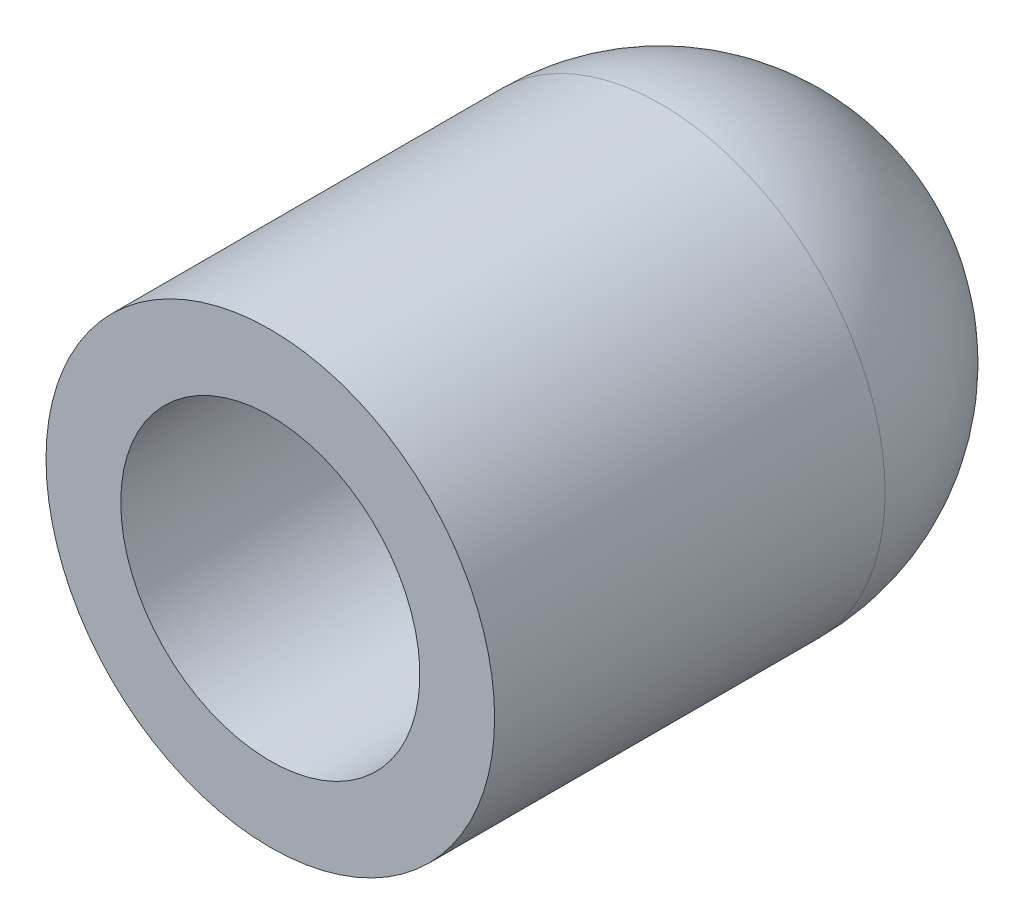
ISO-10303-21;
HEADER;
FILE_DESCRIPTION(('STEP AP214'),'2;1');
FILE_NAME('part.step','',(''),(''),'','','');
FILE_SCHEMA(('AUTOMOTIVE_DESIGN { 1 0 10303 214 1 1 1 1 }'));
ENDSEC;
DATA;
#1=APPLICATION_CONTEXT('core data for automotive mechanical design processes');
#2=APPLICATION_PROTOCOL_DEFINITION('international standard','automotive_design',2000,#1);
#3=PRODUCT_CONTEXT('',#1,'mechanical');
#4=PRODUCT('Part','Part','',(#3));
#5=PRODUCT_RELATED_PRODUCT_CATEGORY('part','',(#4));
#6=PRODUCT_DEFINITION_FORMATION('','',#4);
#7=PRODUCT_DEFINITION_CONTEXT('part definition',#1,'design');
#8=PRODUCT_DEFINITION('design','',#6,#7);
#9=PRODUCT_DEFINITION_SHAPE('','',#8);
#10=(LENGTH_UNIT() NAMED_UNIT(*) SI_UNIT(.MILLI.,.METRE.));
#11=(NAMED_UNIT(*) PLANE_ANGLE_UNIT() SI_UNIT($,.RADIAN.));
#12=(NAMED_UNIT(*) SI_UNIT($,.STERADIAN.) SOLID_ANGLE_UNIT());
#13=UNCERTAINTY_MEASURE_WITH_UNIT(LENGTH_MEASURE(1.E-05),#10,'distance_accuracy_value','');
#14=(GEOMETRIC_REPRESENTATION_CONTEXT(3) GLOBAL_UNCERTAINTY_ASSIGNED_CONTEXT((#13)) GLOBAL_UNIT_ASSIGNED_CONTEXT((#10,
#11,#12)) REPRESENTATION_CONTEXT('',''));
#15=CARTESIAN_POINT('',(0.,0.,0.));
#16=DIRECTION('',(0.,0.,1.));
#17=DIRECTION('',(1.,0.,0.));
#18=AXIS2_PLACEMENT_3D('',#15,#16,#17);
#19=CARTESIAN_POINT('',(0.,0.,-3.375));
#20=DIRECTION('',(0.,0.,-1.));
#21=DIRECTION('',(-1.,0.,0.));
#22=AXIS2_PLACEMENT_3D('',#19,#20,#21);
#23=CYLINDRICAL_SURFACE('',#22,3.375);
#24=CARTESIAN_POINT('',(0.,0.,5.875));
#25=DIRECTION('',(0.,0.,-1.));
#26=DIRECTION('',(-1.,0.,0.));
#27=AXIS2_PLACEMENT_3D('',#24,#25,#26);
#28=CIRCLE('',#27,3.375);
#29=CARTESIAN_POINT('',(-3.375,0.,5.875));
#30=VERTEX_POINT('',#29);
#31=EDGE_CURVE('E56',#30,#30,#28,.T.);
#32=ORIENTED_EDGE('',*,*,#31,.T.);
#33=EDGE_LOOP('',(#32));
#34=FACE_BOUND('',#33,.T.);
#35=CARTESIAN_POINT('',(0.,0.,0.));
#36=DIRECTION('',(0.,0.,-1.));
#37=DIRECTION('',(-1.,0.,0.));
#38=AXIS2_PLACEMENT_3D('',#35,#36,#37);
#39=CIRCLE('',#38,3.375);
#40=CARTESIAN_POINT('',(-3.375,0.,0.));
#41=VERTEX_POINT('',#40);
#42=EDGE_CURVE('E10',#41,#41,#39,.T.);
#43=ORIENTED_EDGE('',*,*,#42,.F.);
#44=EDGE_LOOP('',(#43));
#45=FACE_BOUND('',#44,.T.);
#46=ADVANCED_FACE('F39',(#34,#45),#23,.T.);
#47=CARTESIAN_POINT('',(0.,0.,0.));
#48=DIRECTION('',(0.,0.,-1.));
#49=DIRECTION('',(1.,0.,0.));
#50=AXIS2_PLACEMENT_3D('',#47,#48,#49);
#51=SPHERICAL_SURFACE('',#50,3.375);
#52=ORIENTED_EDGE('',*,*,#42,.T.);
#53=EDGE_LOOP('',(#52));
#54=FACE_BOUND('',#53,.T.);
#55=ADVANCED_FACE('F77',(#54),#51,.T.);
#56=CARTESIAN_POINT('',(0.,0.,0.));
#57=DIRECTION('',(0.,0.,-1.));
#58=DIRECTION('',(1.,0.,0.));
#59=AXIS2_PLACEMENT_3D('',#56,#57,#58);
#60=SPHERICAL_SURFACE('',#59,2.25);
#61=CARTESIAN_POINT('',(0.,0.,0.));
#62=DIRECTION('',(0.,0.,-1.));
#63=DIRECTION('',(-1.,0.,0.));
#64=AXIS2_PLACEMENT_3D('',#61,#62,#63);
#65=CIRCLE('',#64,2.25);
#66=CARTESIAN_POINT('',(-2.25,0.,0.));
#67=VERTEX_POINT('',#66);
#68=EDGE_CURVE('E46',#67,#67,#65,.T.);
#69=ORIENTED_EDGE('',*,*,#68,.F.);
#70=EDGE_LOOP('',(#69));
#71=FACE_BOUND('',#70,.T.);
#72=ADVANCED_FACE('F73',(#71),#60,.F.);
#73=CARTESIAN_POINT('',(0.,0.,-3.375));
#74=DIRECTION('',(0.,0.,-1.));
#75=DIRECTION('',(-1.,0.,0.));
#76=AXIS2_PLACEMENT_3D('',#73,#74,#75);
#77=CYLINDRICAL_SURFACE('',#76,2.25);
#78=CARTESIAN_POINT('',(0.,0.,5.875));
#79=DIRECTION('',(0.,0.,-1.));
#80=DIRECTION('',(-1.,0.,0.));
#81=AXIS2_PLACEMENT_3D('',#78,#79,#80);
#82=CIRCLE('',#81,2.25);
#83=CARTESIAN_POINT('',(-2.25,0.,5.875));
#84=VERTEX_POINT('',#83);
#85=EDGE_CURVE('E51',#84,#84,#82,.T.);
#86=ORIENTED_EDGE('',*,*,#85,.F.);
#87=EDGE_LOOP('',(#86));
#88=FACE_BOUND('',#87,.T.);
#89=ORIENTED_EDGE('',*,*,#68,.T.);
#90=EDGE_LOOP('',(#89));
#91=FACE_BOUND('',#90,.T.);
#92=ADVANCED_FACE('F67',(#88,#91),#77,.F.);
#93=CARTESIAN_POINT('',(0.,0.,5.875));
#94=DIRECTION('',(0.,0.,1.));
#95=DIRECTION('',(1.,0.,0.));
#96=AXIS2_PLACEMENT_3D('',#93,#94,#95);
#97=PLANE('',#96);
#98=ORIENTED_EDGE('',*,*,#85,.T.);
#99=EDGE_LOOP('',(#98));
#100=FACE_BOUND('',#99,.T.);
#101=ORIENTED_EDGE('',*,*,#31,.F.);
#102=EDGE_LOOP('',(#101));
#103=FACE_BOUND('',#102,.T.);
#104=ADVANCED_FACE('F65',(#100,#103),#97,.T.);
#105=CLOSED_SHELL('',(#46,#55,#72,#92,#104));
#106=MANIFOLD_SOLID_BREP('B2',#105);
#107=ADVANCED_BREP_SHAPE_REPRESENTATION('',(#18,#106),#14);
#108=SHAPE_DEFINITION_REPRESENTATION(#9,#107);
ENDSEC;
END-ISO-10303-21;
